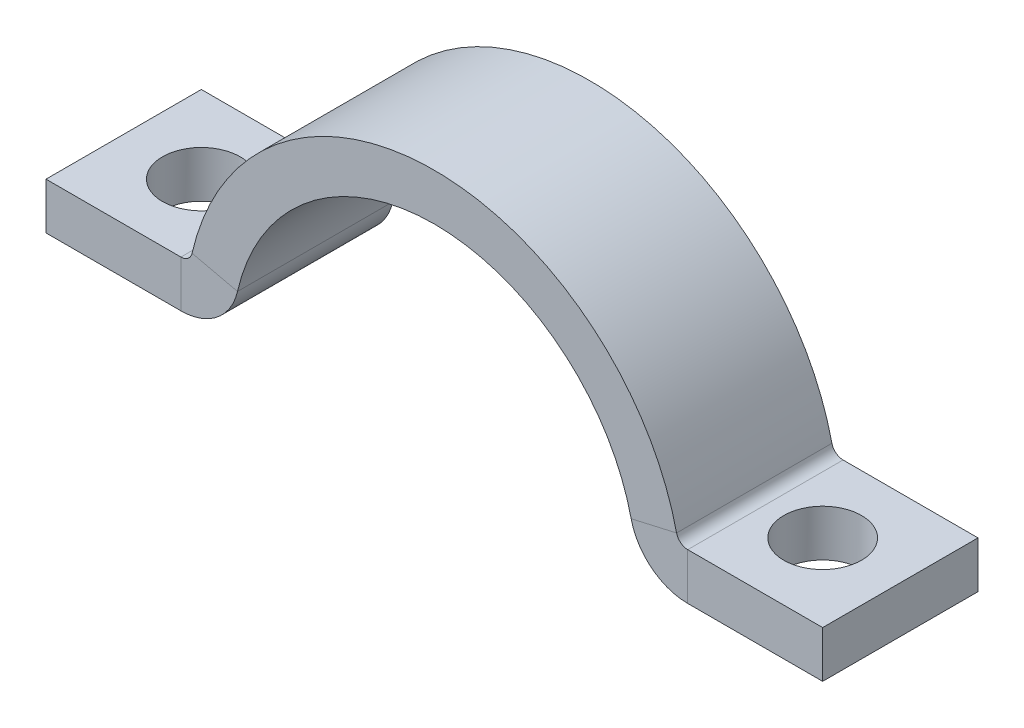
ISO-10303-21;
HEADER;
FILE_DESCRIPTION(('STEP AP214'),'2;1');
FILE_NAME('part.step','',(''),(''),'','','');
FILE_SCHEMA(('AUTOMOTIVE_DESIGN { 1 0 10303 214 1 1 1 1 }'));
ENDSEC;
DATA;
#1=APPLICATION_CONTEXT('core data for automotive mechanical design processes');
#2=APPLICATION_PROTOCOL_DEFINITION('international standard','automotive_design',2000,#1);
#3=PRODUCT_CONTEXT('',#1,'mechanical');
#4=PRODUCT('Part','Part','',(#3));
#5=PRODUCT_RELATED_PRODUCT_CATEGORY('part','',(#4));
#6=PRODUCT_DEFINITION_FORMATION('','',#4);
#7=PRODUCT_DEFINITION_CONTEXT('part definition',#1,'design');
#8=PRODUCT_DEFINITION('design','',#6,#7);
#9=PRODUCT_DEFINITION_SHAPE('','',#8);
#10=(LENGTH_UNIT() NAMED_UNIT(*) SI_UNIT(.MILLI.,.METRE.));
#11=(NAMED_UNIT(*) PLANE_ANGLE_UNIT() SI_UNIT($,.RADIAN.));
#12=(NAMED_UNIT(*) SI_UNIT($,.STERADIAN.) SOLID_ANGLE_UNIT());
#13=UNCERTAINTY_MEASURE_WITH_UNIT(LENGTH_MEASURE(1.E-05),#10,'distance_accuracy_value','');
#14=(GEOMETRIC_REPRESENTATION_CONTEXT(3) GLOBAL_UNCERTAINTY_ASSIGNED_CONTEXT((#13)) GLOBAL_UNIT_ASSIGNED_CONTEXT((#10,
#11,#12)) REPRESENTATION_CONTEXT('',''));
#15=CARTESIAN_POINT('',(0.,0.,0.));
#16=DIRECTION('',(0.,0.,1.));
#17=DIRECTION('',(1.,0.,0.));
#18=AXIS2_PLACEMENT_3D('',#15,#16,#17);
#19=CARTESIAN_POINT('',(-16.3141533644869,0.,5.));
#20=DIRECTION('',(0.,0.,1.));
#21=DIRECTION('',(1.,0.,0.));
#22=AXIS2_PLACEMENT_3D('',#19,#20,#21);
#23=PLANE('',#22);
#24=DIRECTION('',(0.,1.,0.));
#25=VECTOR('',#24,1.);
#26=CARTESIAN_POINT('',(-16.3141533644869,0.,5.));
#27=LINE('',#26,#25);
#28=CARTESIAN_POINT('',(-16.3141533644869,0.,5.));
#29=VERTEX_POINT('',#28);
#30=CARTESIAN_POINT('',(-16.3141533644869,3.,5.));
#31=VERTEX_POINT('',#30);
#32=EDGE_CURVE('E11',#29,#31,#27,.T.);
#33=ORIENTED_EDGE('',*,*,#32,.F.);
#34=CARTESIAN_POINT('',(-16.3141533644869,3.7366,5.));
#35=DIRECTION('',(0.,0.,1.));
#36=DIRECTION('',(1.,0.,0.));
#37=AXIS2_PLACEMENT_3D('',#34,#35,#36);
#38=CIRCLE('',#37,3.7366);
#39=CARTESIAN_POINT('',(-12.6718684642239,2.90236965691957,5.));
#40=VERTEX_POINT('',#39);
#41=EDGE_CURVE('E244',#40,#29,#38,.F.);
#42=ORIENTED_EDGE('',*,*,#41,.F.);
#43=DIRECTION('',(0.974759112632609,-0.223259204378428,0.));
#44=VECTOR('',#43,1.);
#45=CARTESIAN_POINT('',(-15.5961458021217,3.57214727005485,5.));
#46=LINE('',#45,#44);
#47=CARTESIAN_POINT('',(-15.5961458021217,3.57214727005485,5.));
#48=VERTEX_POINT('',#47);
#49=EDGE_CURVE('E46',#48,#40,#46,.T.);
#50=ORIENTED_EDGE('',*,*,#49,.F.);
#51=CARTESIAN_POINT('',(-16.3141533644869,3.7366,5.));
#52=DIRECTION('',(0.,0.,1.));
#53=DIRECTION('',(1.,0.,0.));
#54=AXIS2_PLACEMENT_3D('',#51,#52,#53);
#55=CIRCLE('',#54,0.7366);
#56=EDGE_CURVE('E170',#48,#31,#55,.F.);
#57=ORIENTED_EDGE('',*,*,#56,.T.);
#58=EDGE_LOOP('',(#33,#42,#50,#57));
#59=FACE_BOUND('',#58,.T.);
#60=ADVANCED_FACE('F37',(#59),#23,.T.);
#61=CARTESIAN_POINT('',(-15.5961458021217,3.57214727005485,5.));
#62=DIRECTION('',(0.,0.,1.));
#63=DIRECTION('',(1.,0.,0.));
#64=AXIS2_PLACEMENT_3D('',#61,#62,#63);
#65=PLANE('',#64);
#66=DIRECTION('',(-1.,0.,0.));
#67=VECTOR('',#66,1.);
#68=CARTESIAN_POINT('',(-25.,0.,5.));
#69=LINE('',#68,#67);
#70=CARTESIAN_POINT('',(-25.,0.,5.));
#71=VERTEX_POINT('',#70);
#72=EDGE_CURVE('E248',#29,#71,#69,.T.);
#73=ORIENTED_EDGE('',*,*,#72,.F.);
#74=ORIENTED_EDGE('',*,*,#32,.T.);
#75=DIRECTION('',(1.,0.,0.));
#76=VECTOR('',#75,1.);
#77=CARTESIAN_POINT('',(-25.,3.,5.));
#78=LINE('',#77,#76);
#79=CARTESIAN_POINT('',(-25.,3.,5.));
#80=VERTEX_POINT('',#79);
#81=EDGE_CURVE('E106',#31,#80,#78,.F.);
#82=ORIENTED_EDGE('',*,*,#81,.T.);
#83=DIRECTION('',(0.,1.,0.));
#84=VECTOR('',#83,1.);
#85=CARTESIAN_POINT('',(-25.,0.,5.));
#86=LINE('',#85,#84);
#87=EDGE_CURVE('E555',#71,#80,#86,.T.);
#88=ORIENTED_EDGE('',*,*,#87,.F.);
#89=EDGE_LOOP('',(#73,#74,#82,#88));
#90=FACE_BOUND('',#89,.T.);
#91=ADVANCED_FACE('F297',(#90),#65,.T.);
#92=CARTESIAN_POINT('',(-12.6718684642239,2.90236965691957,-5.));
#93=DIRECTION('',(0.,0.,-1.));
#94=DIRECTION('',(-1.,0.,0.));
#95=AXIS2_PLACEMENT_3D('',#92,#93,#94);
#96=PLANE('',#95);
#97=DIRECTION('',(-0.974759112632609,0.223259204378428,0.));
#98=VECTOR('',#97,1.);
#99=CARTESIAN_POINT('',(-12.6718684642239,2.90236965691957,-5.));
#100=LINE('',#99,#98);
#101=CARTESIAN_POINT('',(-12.6718684642239,2.90236965691957,-5.));
#102=VERTEX_POINT('',#101);
#103=CARTESIAN_POINT('',(-15.5961458021217,3.57214727005485,-5.));
#104=VERTEX_POINT('',#103);
#105=EDGE_CURVE('E93',#102,#104,#100,.T.);
#106=ORIENTED_EDGE('',*,*,#105,.F.);
#107=CARTESIAN_POINT('',(-16.3141533644869,3.7366,-5.));
#108=DIRECTION('',(0.,0.,1.));
#109=DIRECTION('',(1.,0.,0.));
#110=AXIS2_PLACEMENT_3D('',#107,#108,#109);
#111=CIRCLE('',#110,3.7366);
#112=CARTESIAN_POINT('',(-16.3141533644869,0.,-5.));
#113=VERTEX_POINT('',#112);
#114=EDGE_CURVE('E185',#102,#113,#111,.F.);
#115=ORIENTED_EDGE('',*,*,#114,.T.);
#116=DIRECTION('',(0.,-1.,0.));
#117=VECTOR('',#116,1.);
#118=CARTESIAN_POINT('',(-16.3141533644869,3.,-5.));
#119=LINE('',#118,#117);
#120=CARTESIAN_POINT('',(-16.3141533644869,3.,-5.));
#121=VERTEX_POINT('',#120);
#122=EDGE_CURVE('E100',#121,#113,#119,.T.);
#123=ORIENTED_EDGE('',*,*,#122,.F.);
#124=CARTESIAN_POINT('',(-16.3141533644869,3.7366,-5.));
#125=DIRECTION('',(0.,0.,1.));
#126=DIRECTION('',(1.,0.,0.));
#127=AXIS2_PLACEMENT_3D('',#124,#125,#126);
#128=CIRCLE('',#127,0.7366);
#129=EDGE_CURVE('E204',#104,#121,#128,.F.);
#130=ORIENTED_EDGE('',*,*,#129,.F.);
#131=EDGE_LOOP('',(#106,#115,#123,#130));
#132=FACE_BOUND('',#131,.T.);
#133=ADVANCED_FACE('F301',(#132),#96,.T.);
#134=CARTESIAN_POINT('',(-16.3141533644869,3.,-5.));
#135=DIRECTION('',(0.,0.,-1.));
#136=DIRECTION('',(-1.,0.,0.));
#137=AXIS2_PLACEMENT_3D('',#134,#135,#136);
#138=PLANE('',#137);
#139=CARTESIAN_POINT('',(0.,0.,-5.));
#140=DIRECTION('',(0.,0.,1.));
#141=DIRECTION('',(-1.,0.,0.));
#142=AXIS2_PLACEMENT_3D('',#139,#140,#141);
#143=CIRCLE('',#142,13.);
#144=CARTESIAN_POINT('',(12.6718684642239,2.90236965691957,-5.));
#145=VERTEX_POINT('',#144);
#146=EDGE_CURVE('E187',#145,#102,#143,.T.);
#147=ORIENTED_EDGE('',*,*,#146,.T.);
#148=ORIENTED_EDGE('',*,*,#105,.T.);
#149=CARTESIAN_POINT('',(0.,0.,-5.));
#150=DIRECTION('',(0.,0.,1.));
#151=DIRECTION('',(1.,0.,0.));
#152=AXIS2_PLACEMENT_3D('',#149,#150,#151);
#153=CIRCLE('',#152,16.);
#154=CARTESIAN_POINT('',(15.5961458021217,3.57214727005485,-5.));
#155=VERTEX_POINT('',#154);
#156=EDGE_CURVE('E202',#155,#104,#153,.T.);
#157=ORIENTED_EDGE('',*,*,#156,.F.);
#158=DIRECTION('',(-0.974759112632609,-0.223259204378428,0.));
#159=VECTOR('',#158,1.);
#160=CARTESIAN_POINT('',(15.5961458021217,3.57214727005485,-5.));
#161=LINE('',#160,#159);
#162=EDGE_CURVE('E230',#155,#145,#161,.T.);
#163=ORIENTED_EDGE('',*,*,#162,.T.);
#164=EDGE_LOOP('',(#147,#148,#157,#163));
#165=FACE_BOUND('',#164,.T.);
#166=ADVANCED_FACE('F274',(#165),#138,.T.);
#167=CARTESIAN_POINT('',(12.6718684642239,2.90236965691957,5.));
#168=DIRECTION('',(0.,0.,1.));
#169=DIRECTION('',(1.,0.,0.));
#170=AXIS2_PLACEMENT_3D('',#167,#168,#169);
#171=PLANE('',#170);
#172=DIRECTION('',(0.974759112632609,0.223259204378428,0.));
#173=VECTOR('',#172,1.);
#174=CARTESIAN_POINT('',(12.6718684642239,2.90236965691957,5.));
#175=LINE('',#174,#173);
#176=CARTESIAN_POINT('',(12.6718684642239,2.90236965691957,5.));
#177=VERTEX_POINT('',#176);
#178=CARTESIAN_POINT('',(15.5961458021217,3.57214727005485,5.));
#179=VERTEX_POINT('',#178);
#180=EDGE_CURVE('E134',#177,#179,#175,.T.);
#181=ORIENTED_EDGE('',*,*,#180,.F.);
#182=CARTESIAN_POINT('',(16.3141533644869,3.7366,5.));
#183=DIRECTION('',(0.,0.,1.));
#184=DIRECTION('',(1.,0.,0.));
#185=AXIS2_PLACEMENT_3D('',#182,#183,#184);
#186=CIRCLE('',#185,3.7366);
#187=CARTESIAN_POINT('',(16.3141533644869,0.,5.));
#188=VERTEX_POINT('',#187);
#189=EDGE_CURVE('E251',#188,#177,#186,.F.);
#190=ORIENTED_EDGE('',*,*,#189,.F.);
#191=DIRECTION('',(0.,-1.,0.));
#192=VECTOR('',#191,1.);
#193=CARTESIAN_POINT('',(16.3141533644869,3.,5.));
#194=LINE('',#193,#192);
#195=CARTESIAN_POINT('',(16.3141533644869,3.,5.));
#196=VERTEX_POINT('',#195);
#197=EDGE_CURVE('E146',#196,#188,#194,.T.);
#198=ORIENTED_EDGE('',*,*,#197,.F.);
#199=CARTESIAN_POINT('',(16.3141533644869,3.7366,5.));
#200=DIRECTION('',(0.,0.,1.));
#201=DIRECTION('',(1.,0.,0.));
#202=AXIS2_PLACEMENT_3D('',#199,#200,#201);
#203=CIRCLE('',#202,0.7366);
#204=EDGE_CURVE('E149',#196,#179,#203,.F.);
#205=ORIENTED_EDGE('',*,*,#204,.T.);
#206=EDGE_LOOP('',(#181,#190,#198,#205));
#207=FACE_BOUND('',#206,.T.);
#208=ADVANCED_FACE('F151',(#207),#171,.T.);
#209=CARTESIAN_POINT('',(16.3141533644869,3.,5.));
#210=DIRECTION('',(0.,0.,1.));
#211=DIRECTION('',(1.,0.,0.));
#212=AXIS2_PLACEMENT_3D('',#209,#210,#211);
#213=PLANE('',#212);
#214=CARTESIAN_POINT('',(0.,0.,5.));
#215=DIRECTION('',(0.,0.,1.));
#216=DIRECTION('',(-1.,0.,0.));
#217=AXIS2_PLACEMENT_3D('',#214,#215,#216);
#218=CIRCLE('',#217,13.);
#219=EDGE_CURVE('E141',#177,#40,#218,.T.);
#220=ORIENTED_EDGE('',*,*,#219,.F.);
#221=ORIENTED_EDGE('',*,*,#180,.T.);
#222=CARTESIAN_POINT('',(0.,0.,5.));
#223=DIRECTION('',(0.,0.,1.));
#224=DIRECTION('',(1.,0.,0.));
#225=AXIS2_PLACEMENT_3D('',#222,#223,#224);
#226=CIRCLE('',#225,16.);
#227=EDGE_CURVE('E138',#179,#48,#226,.T.);
#228=ORIENTED_EDGE('',*,*,#227,.T.);
#229=ORIENTED_EDGE('',*,*,#49,.T.);
#230=EDGE_LOOP('',(#220,#221,#228,#229));
#231=FACE_BOUND('',#230,.T.);
#232=ADVANCED_FACE('F136',(#231),#213,.T.);
#233=CARTESIAN_POINT('',(16.3141533644869,0.,-5.));
#234=DIRECTION('',(0.,0.,-1.));
#235=DIRECTION('',(-1.,0.,0.));
#236=AXIS2_PLACEMENT_3D('',#233,#234,#235);
#237=PLANE('',#236);
#238=DIRECTION('',(0.,1.,0.));
#239=VECTOR('',#238,1.);
#240=CARTESIAN_POINT('',(16.3141533644869,0.,-5.));
#241=LINE('',#240,#239);
#242=CARTESIAN_POINT('',(16.3141533644869,0.,-5.));
#243=VERTEX_POINT('',#242);
#244=CARTESIAN_POINT('',(16.3141533644869,3.,-5.));
#245=VERTEX_POINT('',#244);
#246=EDGE_CURVE('E232',#243,#245,#241,.T.);
#247=ORIENTED_EDGE('',*,*,#246,.F.);
#248=CARTESIAN_POINT('',(16.3141533644869,3.7366,-5.));
#249=DIRECTION('',(0.,0.,1.));
#250=DIRECTION('',(1.,0.,0.));
#251=AXIS2_PLACEMENT_3D('',#248,#249,#250);
#252=CIRCLE('',#251,3.7366);
#253=EDGE_CURVE('E189',#243,#145,#252,.F.);
#254=ORIENTED_EDGE('',*,*,#253,.T.);
#255=ORIENTED_EDGE('',*,*,#162,.F.);
#256=CARTESIAN_POINT('',(16.3141533644869,3.7366,-5.));
#257=DIRECTION('',(0.,0.,1.));
#258=DIRECTION('',(1.,0.,0.));
#259=AXIS2_PLACEMENT_3D('',#256,#257,#258);
#260=CIRCLE('',#259,0.7366);
#261=EDGE_CURVE('E162',#245,#155,#260,.F.);
#262=ORIENTED_EDGE('',*,*,#261,.F.);
#263=EDGE_LOOP('',(#247,#254,#255,#262));
#264=FACE_BOUND('',#263,.T.);
#265=ADVANCED_FACE('F272',(#264),#237,.T.);
#266=CARTESIAN_POINT('',(15.5961458021217,3.57214727005485,-5.));
#267=DIRECTION('',(0.,0.,-1.));
#268=DIRECTION('',(-1.,0.,0.));
#269=AXIS2_PLACEMENT_3D('',#266,#267,#268);
#270=PLANE('',#269);
#271=DIRECTION('',(-1.,0.,0.));
#272=VECTOR('',#271,1.);
#273=CARTESIAN_POINT('',(25.,0.,-5.));
#274=LINE('',#273,#272);
#275=CARTESIAN_POINT('',(25.,0.,-5.));
#276=VERTEX_POINT('',#275);
#277=EDGE_CURVE('E192',#276,#243,#274,.T.);
#278=ORIENTED_EDGE('',*,*,#277,.T.);
#279=ORIENTED_EDGE('',*,*,#246,.T.);
#280=DIRECTION('',(1.,0.,0.));
#281=VECTOR('',#280,1.);
#282=CARTESIAN_POINT('',(25.,3.,-5.));
#283=LINE('',#282,#281);
#284=CARTESIAN_POINT('',(25.,3.,-5.));
#285=VERTEX_POINT('',#284);
#286=EDGE_CURVE('E198',#285,#245,#283,.F.);
#287=ORIENTED_EDGE('',*,*,#286,.F.);
#288=DIRECTION('',(0.,-1.,0.));
#289=VECTOR('',#288,1.);
#290=CARTESIAN_POINT('',(25.,3.,-5.));
#291=LINE('',#290,#289);
#292=EDGE_CURVE('E195',#285,#276,#291,.T.);
#293=ORIENTED_EDGE('',*,*,#292,.T.);
#294=EDGE_LOOP('',(#278,#279,#287,#293));
#295=FACE_BOUND('',#294,.T.);
#296=ADVANCED_FACE('F284',(#295),#270,.T.);
#297=CARTESIAN_POINT('',(-25.,3.,5.));
#298=DIRECTION('',(0.,-1.,0.));
#299=DIRECTION('',(0.,0.,-1.));
#300=AXIS2_PLACEMENT_3D('',#297,#298,#299);
#301=PLANE('',#300);
#302=CARTESIAN_POINT('',(-20.,3.,0.));
#303=DIRECTION('',(0.,1.,0.));
#304=DIRECTION('',(0.,0.,1.));
#305=AXIS2_PLACEMENT_3D('',#302,#303,#304);
#306=CIRCLE('',#305,2.5);
#307=CARTESIAN_POINT('',(-20.,3.,2.5));
#308=VERTEX_POINT('',#307);
#309=EDGE_CURVE('E549',#308,#308,#306,.T.);
#310=ORIENTED_EDGE('',*,*,#309,.F.);
#311=EDGE_LOOP('',(#310));
#312=FACE_BOUND('',#311,.T.);
#313=DIRECTION('',(1.,0.,0.));
#314=VECTOR('',#313,1.);
#315=CARTESIAN_POINT('',(-25.,3.,-5.));
#316=LINE('',#315,#314);
#317=CARTESIAN_POINT('',(-25.,3.,-5.));
#318=VERTEX_POINT('',#317);
#319=EDGE_CURVE('E176',#121,#318,#316,.F.);
#320=ORIENTED_EDGE('',*,*,#319,.T.);
#321=DIRECTION('',(0.,0.,-1.));
#322=VECTOR('',#321,1.);
#323=CARTESIAN_POINT('',(-25.,3.,5.));
#324=LINE('',#323,#322);
#325=EDGE_CURVE('E228',#80,#318,#324,.T.);
#326=ORIENTED_EDGE('',*,*,#325,.F.);
#327=ORIENTED_EDGE('',*,*,#81,.F.);
#328=DIRECTION('',(0.,0.,-1.));
#329=VECTOR('',#328,1.);
#330=CARTESIAN_POINT('',(-16.3141533644869,3.,5.));
#331=LINE('',#330,#329);
#332=EDGE_CURVE('E172',#31,#121,#331,.T.);
#333=ORIENTED_EDGE('',*,*,#332,.T.);
#334=EDGE_LOOP('',(#320,#326,#327,#333));
#335=FACE_BOUND('',#334,.T.);
#336=ADVANCED_FACE('F286',(#312,#335),#301,.F.);
#337=CARTESIAN_POINT('',(-25.,0.,5.));
#338=DIRECTION('',(-1.,0.,0.));
#339=DIRECTION('',(0.,0.,1.));
#340=AXIS2_PLACEMENT_3D('',#337,#338,#339);
#341=PLANE('',#340);
#342=DIRECTION('',(0.,1.,0.));
#343=VECTOR('',#342,1.);
#344=CARTESIAN_POINT('',(-25.,0.,-5.));
#345=LINE('',#344,#343);
#346=CARTESIAN_POINT('',(-25.,0.,-5.));
#347=VERTEX_POINT('',#346);
#348=EDGE_CURVE('E179',#347,#318,#345,.T.);
#349=ORIENTED_EDGE('',*,*,#348,.F.);
#350=DIRECTION('',(0.,0.,-1.));
#351=VECTOR('',#350,1.);
#352=CARTESIAN_POINT('',(-25.,0.,5.));
#353=LINE('',#352,#351);
#354=EDGE_CURVE('E226',#71,#347,#353,.T.);
#355=ORIENTED_EDGE('',*,*,#354,.F.);
#356=ORIENTED_EDGE('',*,*,#87,.T.);
#357=ORIENTED_EDGE('',*,*,#325,.T.);
#358=EDGE_LOOP('',(#349,#355,#356,#357));
#359=FACE_BOUND('',#358,.T.);
#360=ADVANCED_FACE('F292',(#359),#341,.T.);
#361=CARTESIAN_POINT('',(-25.,0.,5.));
#362=DIRECTION('',(0.,-1.,0.));
#363=DIRECTION('',(0.,0.,-1.));
#364=AXIS2_PLACEMENT_3D('',#361,#362,#363);
#365=PLANE('',#364);
#366=CARTESIAN_POINT('',(-20.,0.,0.));
#367=DIRECTION('',(0.,-1.,0.));
#368=DIRECTION('',(0.,0.,-1.));
#369=AXIS2_PLACEMENT_3D('',#366,#367,#368);
#370=CIRCLE('',#369,2.5);
#371=CARTESIAN_POINT('',(-20.,0.,-2.5));
#372=VERTEX_POINT('',#371);
#373=EDGE_CURVE('E40',#372,#372,#370,.T.);
#374=ORIENTED_EDGE('',*,*,#373,.F.);
#375=EDGE_LOOP('',(#374));
#376=FACE_BOUND('',#375,.T.);
#377=DIRECTION('',(-1.,0.,0.));
#378=VECTOR('',#377,1.);
#379=CARTESIAN_POINT('',(-25.,0.,-5.));
#380=LINE('',#379,#378);
#381=EDGE_CURVE('E182',#113,#347,#380,.T.);
#382=ORIENTED_EDGE('',*,*,#381,.F.);
#383=DIRECTION('',(0.,0.,-1.));
#384=VECTOR('',#383,1.);
#385=CARTESIAN_POINT('',(-16.3141533644869,0.,5.));
#386=LINE('',#385,#384);
#387=EDGE_CURVE('E223',#29,#113,#386,.T.);
#388=ORIENTED_EDGE('',*,*,#387,.F.);
#389=ORIENTED_EDGE('',*,*,#72,.T.);
#390=ORIENTED_EDGE('',*,*,#354,.T.);
#391=EDGE_LOOP('',(#382,#388,#389,#390));
#392=FACE_BOUND('',#391,.T.);
#393=ADVANCED_FACE('F336',(#376,#392),#365,.T.);
#394=CARTESIAN_POINT('',(-16.3141533644869,3.7366,5.));
#395=DIRECTION('',(0.,0.,-1.));
#396=DIRECTION('',(-1.,0.,0.));
#397=AXIS2_PLACEMENT_3D('',#394,#395,#396);
#398=CYLINDRICAL_SURFACE('',#397,3.7366);
#399=ORIENTED_EDGE('',*,*,#114,.F.);
#400=DIRECTION('',(0.,0.,-1.));
#401=VECTOR('',#400,1.);
#402=CARTESIAN_POINT('',(-12.6718684642239,2.90236965691957,5.));
#403=LINE('',#402,#401);
#404=EDGE_CURVE('E220',#40,#102,#403,.T.);
#405=ORIENTED_EDGE('',*,*,#404,.F.);
#406=ORIENTED_EDGE('',*,*,#41,.T.);
#407=ORIENTED_EDGE('',*,*,#387,.T.);
#408=EDGE_LOOP('',(#399,#405,#406,#407));
#409=FACE_BOUND('',#408,.T.);
#410=ADVANCED_FACE('F243',(#409),#398,.T.);
#411=CARTESIAN_POINT('',(0.,0.,5.));
#412=DIRECTION('',(0.,0.,-1.));
#413=DIRECTION('',(-1.,0.,0.));
#414=AXIS2_PLACEMENT_3D('',#411,#412,#413);
#415=CYLINDRICAL_SURFACE('',#414,13.);
#416=ORIENTED_EDGE('',*,*,#146,.F.);
#417=DIRECTION('',(0.,0.,-1.));
#418=VECTOR('',#417,1.);
#419=CARTESIAN_POINT('',(12.6718684642239,2.90236965691957,5.));
#420=LINE('',#419,#418);
#421=EDGE_CURVE('E217',#177,#145,#420,.T.);
#422=ORIENTED_EDGE('',*,*,#421,.F.);
#423=ORIENTED_EDGE('',*,*,#219,.T.);
#424=ORIENTED_EDGE('',*,*,#404,.T.);
#425=EDGE_LOOP('',(#416,#422,#423,#424));
#426=FACE_BOUND('',#425,.T.);
#427=ADVANCED_FACE('F250',(#426),#415,.F.);
#428=CARTESIAN_POINT('',(16.3141533644869,3.7366,5.));
#429=DIRECTION('',(0.,0.,-1.));
#430=DIRECTION('',(-1.,0.,0.));
#431=AXIS2_PLACEMENT_3D('',#428,#429,#430);
#432=CYLINDRICAL_SURFACE('',#431,3.7366);
#433=ORIENTED_EDGE('',*,*,#253,.F.);
#434=DIRECTION('',(0.,0.,-1.));
#435=VECTOR('',#434,1.);
#436=CARTESIAN_POINT('',(16.3141533644869,0.,5.));
#437=LINE('',#436,#435);
#438=EDGE_CURVE('E214',#188,#243,#437,.T.);
#439=ORIENTED_EDGE('',*,*,#438,.F.);
#440=ORIENTED_EDGE('',*,*,#189,.T.);
#441=ORIENTED_EDGE('',*,*,#421,.T.);
#442=EDGE_LOOP('',(#433,#439,#440,#441));
#443=FACE_BOUND('',#442,.T.);
#444=ADVANCED_FACE('F276',(#443),#432,.T.);
#445=CARTESIAN_POINT('',(25.,0.,5.));
#446=DIRECTION('',(0.,-1.,0.));
#447=DIRECTION('',(0.,0.,-1.));
#448=AXIS2_PLACEMENT_3D('',#445,#446,#447);
#449=PLANE('',#448);
#450=CARTESIAN_POINT('',(20.,0.,0.));
#451=DIRECTION('',(0.,-1.,0.));
#452=DIRECTION('',(0.,0.,-1.));
#453=AXIS2_PLACEMENT_3D('',#450,#451,#452);
#454=CIRCLE('',#453,2.5);
#455=CARTESIAN_POINT('',(20.,0.,-2.5));
#456=VERTEX_POINT('',#455);
#457=EDGE_CURVE('E544',#456,#456,#454,.F.);
#458=ORIENTED_EDGE('',*,*,#457,.T.);
#459=EDGE_LOOP('',(#458));
#460=FACE_BOUND('',#459,.T.);
#461=ORIENTED_EDGE('',*,*,#277,.F.);
#462=DIRECTION('',(0.,0.,-1.));
#463=VECTOR('',#462,1.);
#464=CARTESIAN_POINT('',(25.,0.,5.));
#465=LINE('',#464,#463);
#466=CARTESIAN_POINT('',(25.,0.,5.));
#467=VERTEX_POINT('',#466);
#468=EDGE_CURVE('E212',#467,#276,#465,.T.);
#469=ORIENTED_EDGE('',*,*,#468,.F.);
#470=DIRECTION('',(-1.,0.,0.));
#471=VECTOR('',#470,1.);
#472=CARTESIAN_POINT('',(25.,0.,5.));
#473=LINE('',#472,#471);
#474=EDGE_CURVE('E253',#467,#188,#473,.T.);
#475=ORIENTED_EDGE('',*,*,#474,.T.);
#476=ORIENTED_EDGE('',*,*,#438,.T.);
#477=EDGE_LOOP('',(#461,#469,#475,#476));
#478=FACE_BOUND('',#477,.T.);
#479=ADVANCED_FACE('F279',(#460,#478),#449,.T.);
#480=CARTESIAN_POINT('',(25.,3.,5.));
#481=DIRECTION('',(1.,0.,0.));
#482=DIRECTION('',(0.,0.,-1.));
#483=AXIS2_PLACEMENT_3D('',#480,#481,#482);
#484=PLANE('',#483);
#485=ORIENTED_EDGE('',*,*,#292,.F.);
#486=DIRECTION('',(0.,0.,-1.));
#487=VECTOR('',#486,1.);
#488=CARTESIAN_POINT('',(25.,3.,5.));
#489=LINE('',#488,#487);
#490=CARTESIAN_POINT('',(25.,3.,5.));
#491=VERTEX_POINT('',#490);
#492=EDGE_CURVE('E210',#491,#285,#489,.T.);
#493=ORIENTED_EDGE('',*,*,#492,.F.);
#494=DIRECTION('',(0.,-1.,0.));
#495=VECTOR('',#494,1.);
#496=CARTESIAN_POINT('',(25.,3.,5.));
#497=LINE('',#496,#495);
#498=EDGE_CURVE('E259',#491,#467,#497,.T.);
#499=ORIENTED_EDGE('',*,*,#498,.T.);
#500=ORIENTED_EDGE('',*,*,#468,.T.);
#501=EDGE_LOOP('',(#485,#493,#499,#500));
#502=FACE_BOUND('',#501,.T.);
#503=ADVANCED_FACE('F282',(#502),#484,.T.);
#504=CARTESIAN_POINT('',(25.,3.,5.));
#505=DIRECTION('',(0.,-1.,0.));
#506=DIRECTION('',(0.,0.,-1.));
#507=AXIS2_PLACEMENT_3D('',#504,#505,#506);
#508=PLANE('',#507);
#509=CARTESIAN_POINT('',(20.,3.,0.));
#510=DIRECTION('',(0.,-1.,0.));
#511=DIRECTION('',(0.,0.,1.));
#512=AXIS2_PLACEMENT_3D('',#509,#510,#511);
#513=CIRCLE('',#512,2.5);
#514=CARTESIAN_POINT('',(20.,3.,2.5));
#515=VERTEX_POINT('',#514);
#516=EDGE_CURVE('E547',#515,#515,#513,.T.);
#517=ORIENTED_EDGE('',*,*,#516,.T.);
#518=EDGE_LOOP('',(#517));
#519=FACE_BOUND('',#518,.T.);
#520=ORIENTED_EDGE('',*,*,#286,.T.);
#521=DIRECTION('',(0.,0.,-1.));
#522=VECTOR('',#521,1.);
#523=CARTESIAN_POINT('',(16.3141533644869,3.,5.));
#524=LINE('',#523,#522);
#525=EDGE_CURVE('E164',#196,#245,#524,.T.);
#526=ORIENTED_EDGE('',*,*,#525,.F.);
#527=DIRECTION('',(1.,0.,0.));
#528=VECTOR('',#527,1.);
#529=CARTESIAN_POINT('',(25.,3.,5.));
#530=LINE('',#529,#528);
#531=EDGE_CURVE('E155',#491,#196,#530,.F.);
#532=ORIENTED_EDGE('',*,*,#531,.F.);
#533=ORIENTED_EDGE('',*,*,#492,.T.);
#534=EDGE_LOOP('',(#520,#526,#532,#533));
#535=FACE_BOUND('',#534,.T.);
#536=ADVANCED_FACE('F269',(#519,#535),#508,.F.);
#537=CARTESIAN_POINT('',(16.3141533644869,3.7366,5.));
#538=DIRECTION('',(0.,0.,-1.));
#539=DIRECTION('',(-1.,0.,0.));
#540=AXIS2_PLACEMENT_3D('',#537,#538,#539);
#541=CYLINDRICAL_SURFACE('',#540,0.7366);
#542=ORIENTED_EDGE('',*,*,#261,.T.);
#543=DIRECTION('',(0.,0.,-1.));
#544=VECTOR('',#543,1.);
#545=CARTESIAN_POINT('',(15.5961458021217,3.57214727005485,5.));
#546=LINE('',#545,#544);
#547=EDGE_CURVE('E159',#179,#155,#546,.T.);
#548=ORIENTED_EDGE('',*,*,#547,.F.);
#549=ORIENTED_EDGE('',*,*,#204,.F.);
#550=ORIENTED_EDGE('',*,*,#525,.T.);
#551=EDGE_LOOP('',(#542,#548,#549,#550));
#552=FACE_BOUND('',#551,.T.);
#553=ADVANCED_FACE('F160',(#552),#541,.F.);
#554=CARTESIAN_POINT('',(0.,0.,5.));
#555=DIRECTION('',(0.,0.,-1.));
#556=DIRECTION('',(-1.,0.,0.));
#557=AXIS2_PLACEMENT_3D('',#554,#555,#556);
#558=CYLINDRICAL_SURFACE('',#557,16.);
#559=ORIENTED_EDGE('',*,*,#156,.T.);
#560=DIRECTION('',(0.,0.,-1.));
#561=VECTOR('',#560,1.);
#562=CARTESIAN_POINT('',(-15.5961458021217,3.57214727005485,5.));
#563=LINE('',#562,#561);
#564=EDGE_CURVE('E165',#48,#104,#563,.T.);
#565=ORIENTED_EDGE('',*,*,#564,.F.);
#566=ORIENTED_EDGE('',*,*,#227,.F.);
#567=ORIENTED_EDGE('',*,*,#547,.T.);
#568=EDGE_LOOP('',(#559,#565,#566,#567));
#569=FACE_BOUND('',#568,.T.);
#570=ADVANCED_FACE('F167',(#569),#558,.T.);
#571=CARTESIAN_POINT('',(-16.3141533644869,3.7366,5.));
#572=DIRECTION('',(0.,0.,-1.));
#573=DIRECTION('',(-1.,0.,0.));
#574=AXIS2_PLACEMENT_3D('',#571,#572,#573);
#575=CYLINDRICAL_SURFACE('',#574,0.7366);
#576=ORIENTED_EDGE('',*,*,#129,.T.);
#577=ORIENTED_EDGE('',*,*,#332,.F.);
#578=ORIENTED_EDGE('',*,*,#56,.F.);
#579=ORIENTED_EDGE('',*,*,#564,.T.);
#580=EDGE_LOOP('',(#576,#577,#578,#579));
#581=FACE_BOUND('',#580,.T.);
#582=ADVANCED_FACE('F398',(#581),#575,.F.);
#583=CARTESIAN_POINT('',(-16.3141533644869,3.7366,5.));
#584=DIRECTION('',(0.,0.,1.));
#585=DIRECTION('',(1.,0.,0.));
#586=AXIS2_PLACEMENT_3D('',#583,#584,#585);
#587=PLANE('',#586);
#588=ORIENTED_EDGE('',*,*,#531,.T.);
#589=ORIENTED_EDGE('',*,*,#197,.T.);
#590=ORIENTED_EDGE('',*,*,#474,.F.);
#591=ORIENTED_EDGE('',*,*,#498,.F.);
#592=EDGE_LOOP('',(#588,#589,#590,#591));
#593=FACE_BOUND('',#592,.T.);
#594=ADVANCED_FACE('F265',(#593),#587,.T.);
#595=CARTESIAN_POINT('',(-16.3141533644869,3.7366,-5.));
#596=DIRECTION('',(0.,0.,1.));
#597=DIRECTION('',(1.,0.,0.));
#598=AXIS2_PLACEMENT_3D('',#595,#596,#597);
#599=PLANE('',#598);
#600=ORIENTED_EDGE('',*,*,#319,.F.);
#601=ORIENTED_EDGE('',*,*,#122,.T.);
#602=ORIENTED_EDGE('',*,*,#381,.T.);
#603=ORIENTED_EDGE('',*,*,#348,.T.);
#604=EDGE_LOOP('',(#600,#601,#602,#603));
#605=FACE_BOUND('',#604,.T.);
#606=ADVANCED_FACE('F418',(#605),#599,.F.);
#607=CARTESIAN_POINT('',(-20.,-7.,0.));
#608=DIRECTION('',(0.,1.,0.));
#609=DIRECTION('',(0.,0.,1.));
#610=AXIS2_PLACEMENT_3D('',#607,#608,#609);
#611=CYLINDRICAL_SURFACE('',#610,2.5);
#612=ORIENTED_EDGE('',*,*,#373,.T.);
#613=EDGE_LOOP('',(#612));
#614=FACE_BOUND('',#613,.T.);
#615=ORIENTED_EDGE('',*,*,#309,.T.);
#616=EDGE_LOOP('',(#615));
#617=FACE_BOUND('',#616,.T.);
#618=ADVANCED_FACE('F428',(#614,#617),#611,.F.);
#619=CARTESIAN_POINT('',(20.,-7.,0.));
#620=DIRECTION('',(0.,1.,0.));
#621=DIRECTION('',(0.,0.,1.));
#622=AXIS2_PLACEMENT_3D('',#619,#620,#621);
#623=CYLINDRICAL_SURFACE('',#622,2.5);
#624=ORIENTED_EDGE('',*,*,#457,.F.);
#625=EDGE_LOOP('',(#624));
#626=FACE_BOUND('',#625,.T.);
#627=ORIENTED_EDGE('',*,*,#516,.F.);
#628=EDGE_LOOP('',(#627));
#629=FACE_BOUND('',#628,.T.);
#630=ADVANCED_FACE('F453',(#626,#629),#623,.F.);
#631=CLOSED_SHELL('',(#60,#91,#133,#166,#208,#232,#265,#296,#336,#360,#393,#410,#427,#444,#479,
#503,#536,#553,#570,#582,#594,#606,#618,#630));
#632=MANIFOLD_SOLID_BREP('B2',#631);
#633=ADVANCED_BREP_SHAPE_REPRESENTATION('',(#18,#632),#14);
#634=SHAPE_DEFINITION_REPRESENTATION(#9,#633);
ENDSEC;
END-ISO-10303-21;
